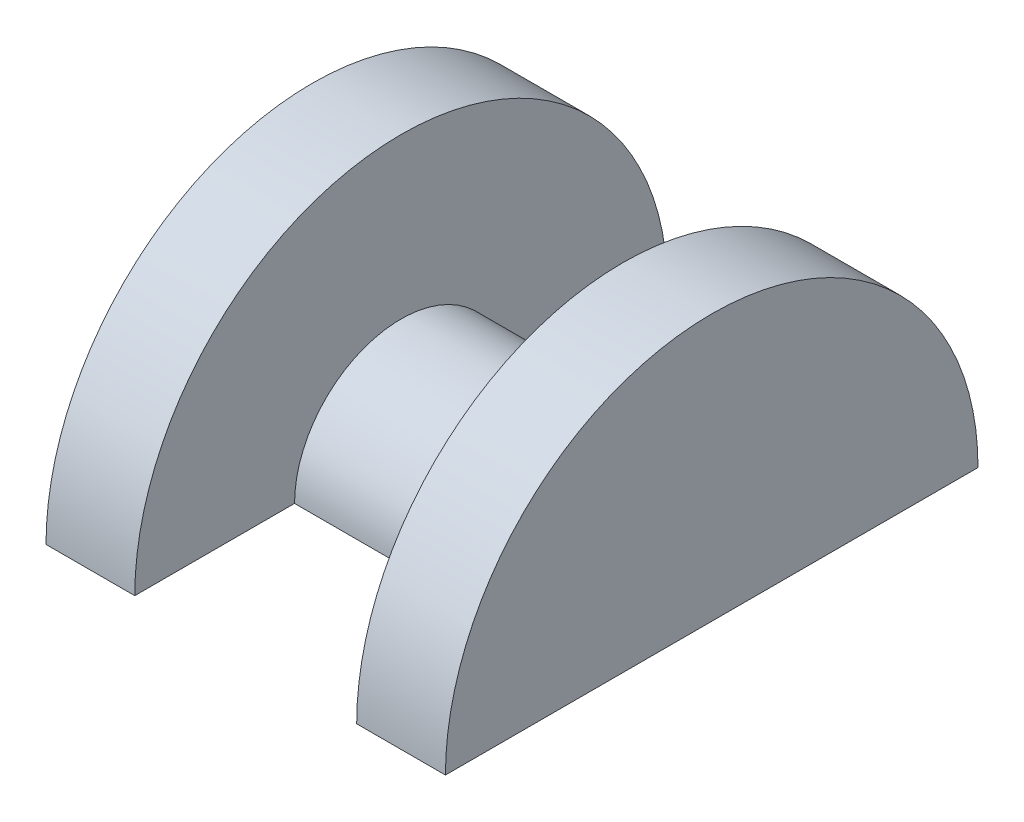
ISO-10303-21;
HEADER;
FILE_DESCRIPTION(('STEP AP214'),'2;1');
FILE_NAME('part.step','',(''),(''),'','','');
FILE_SCHEMA(('AUTOMOTIVE_DESIGN { 1 0 10303 214 1 1 1 1 }'));
ENDSEC;
DATA;
#1=APPLICATION_CONTEXT('core data for automotive mechanical design processes');
#2=APPLICATION_PROTOCOL_DEFINITION('international standard','automotive_design',2000,#1);
#3=PRODUCT_CONTEXT('',#1,'mechanical');
#4=PRODUCT('Part','Part','',(#3));
#5=PRODUCT_RELATED_PRODUCT_CATEGORY('part','',(#4));
#6=PRODUCT_DEFINITION_FORMATION('','',#4);
#7=PRODUCT_DEFINITION_CONTEXT('part definition',#1,'design');
#8=PRODUCT_DEFINITION('design','',#6,#7);
#9=PRODUCT_DEFINITION_SHAPE('','',#8);
#10=(LENGTH_UNIT() NAMED_UNIT(*) SI_UNIT(.MILLI.,.METRE.));
#11=(NAMED_UNIT(*) PLANE_ANGLE_UNIT() SI_UNIT($,.RADIAN.));
#12=(NAMED_UNIT(*) SI_UNIT($,.STERADIAN.) SOLID_ANGLE_UNIT());
#13=UNCERTAINTY_MEASURE_WITH_UNIT(LENGTH_MEASURE(1.E-05),#10,'distance_accuracy_value','');
#14=(GEOMETRIC_REPRESENTATION_CONTEXT(3) GLOBAL_UNCERTAINTY_ASSIGNED_CONTEXT((#13)) GLOBAL_UNIT_ASSIGNED_CONTEXT((#10,
#11,#12)) REPRESENTATION_CONTEXT('',''));
#15=CARTESIAN_POINT('',(0.,0.,0.));
#16=DIRECTION('',(0.,0.,1.));
#17=DIRECTION('',(1.,0.,0.));
#18=AXIS2_PLACEMENT_3D('',#15,#16,#17);
#19=CARTESIAN_POINT('',(1.,0.,0.));
#20=DIRECTION('',(-1.,0.,0.));
#21=DIRECTION('',(0.,0.,1.));
#22=AXIS2_PLACEMENT_3D('',#19,#20,#21);
#23=CYLINDRICAL_SURFACE('',#22,3.);
#24=CARTESIAN_POINT('',(0.,0.,0.));
#25=DIRECTION('',(1.,0.,0.));
#26=DIRECTION('',(0.,0.,-1.));
#27=AXIS2_PLACEMENT_3D('',#24,#25,#26);
#28=CIRCLE('',#27,3.);
#29=CARTESIAN_POINT('',(0.,0.,-3.));
#30=VERTEX_POINT('',#29);
#31=CARTESIAN_POINT('',(0.,0.,3.));
#32=VERTEX_POINT('',#31);
#33=EDGE_CURVE('E83',#30,#32,#28,.T.);
#34=ORIENTED_EDGE('',*,*,#33,.T.);
#35=DIRECTION('',(-1.,0.,0.));
#36=VECTOR('',#35,1.);
#37=CARTESIAN_POINT('',(1.,0.,3.));
#38=LINE('',#37,#36);
#39=CARTESIAN_POINT('',(1.,0.,3.));
#40=VERTEX_POINT('',#39);
#41=EDGE_CURVE('E11',#40,#32,#38,.T.);
#42=ORIENTED_EDGE('',*,*,#41,.F.);
#43=CARTESIAN_POINT('',(1.,0.,0.));
#44=DIRECTION('',(1.,0.,0.));
#45=DIRECTION('',(0.,0.,-1.));
#46=AXIS2_PLACEMENT_3D('',#43,#44,#45);
#47=CIRCLE('',#46,3.);
#48=CARTESIAN_POINT('',(1.,0.,-3.));
#49=VERTEX_POINT('',#48);
#50=EDGE_CURVE('E88',#49,#40,#47,.T.);
#51=ORIENTED_EDGE('',*,*,#50,.F.);
#52=DIRECTION('',(-1.,0.,0.));
#53=VECTOR('',#52,1.);
#54=CARTESIAN_POINT('',(1.,0.,-3.));
#55=LINE('',#54,#53);
#56=EDGE_CURVE('E43',#49,#30,#55,.T.);
#57=ORIENTED_EDGE('',*,*,#56,.T.);
#58=EDGE_LOOP('',(#34,#42,#51,#57));
#59=FACE_BOUND('',#58,.T.);
#60=ADVANCED_FACE('F35',(#59),#23,.T.);
#61=CARTESIAN_POINT('',(1.,0.,0.));
#62=DIRECTION('',(0.,1.,0.));
#63=DIRECTION('',(0.,0.,1.));
#64=AXIS2_PLACEMENT_3D('',#61,#62,#63);
#65=PLANE('',#64);
#66=DIRECTION('',(0.,0.,-1.));
#67=VECTOR('',#66,1.);
#68=CARTESIAN_POINT('',(0.,0.,0.));
#69=LINE('',#68,#67);
#70=CARTESIAN_POINT('',(0.,0.,1.2));
#71=VERTEX_POINT('',#70);
#72=EDGE_CURVE('E82',#32,#71,#69,.T.);
#73=ORIENTED_EDGE('',*,*,#72,.T.);
#74=DIRECTION('',(1.,0.,0.));
#75=VECTOR('',#74,1.);
#76=CARTESIAN_POINT('',(-1.25,0.,1.2));
#77=LINE('',#76,#75);
#78=CARTESIAN_POINT('',(-2.5,0.,1.2));
#79=VERTEX_POINT('',#78);
#80=EDGE_CURVE('E51',#79,#71,#77,.T.);
#81=ORIENTED_EDGE('',*,*,#80,.F.);
#82=DIRECTION('',(0.,0.,-1.));
#83=VECTOR('',#82,1.);
#84=CARTESIAN_POINT('',(-2.5,0.,0.));
#85=LINE('',#84,#83);
#86=CARTESIAN_POINT('',(-2.5,0.,3.));
#87=VERTEX_POINT('',#86);
#88=EDGE_CURVE('E124',#87,#79,#85,.T.);
#89=ORIENTED_EDGE('',*,*,#88,.F.);
#90=DIRECTION('',(1.,0.,0.));
#91=VECTOR('',#90,1.);
#92=CARTESIAN_POINT('',(-3.5,0.,3.));
#93=LINE('',#92,#91);
#94=CARTESIAN_POINT('',(-3.5,0.,3.));
#95=VERTEX_POINT('',#94);
#96=EDGE_CURVE('E107',#95,#87,#93,.T.);
#97=ORIENTED_EDGE('',*,*,#96,.F.);
#98=DIRECTION('',(0.,0.,-1.));
#99=VECTOR('',#98,1.);
#100=CARTESIAN_POINT('',(-3.5,0.,0.));
#101=LINE('',#100,#99);
#102=CARTESIAN_POINT('',(-3.5,0.,-3.));
#103=VERTEX_POINT('',#102);
#104=EDGE_CURVE('E120',#95,#103,#101,.T.);
#105=ORIENTED_EDGE('',*,*,#104,.T.);
#106=DIRECTION('',(1.,0.,0.));
#107=VECTOR('',#106,1.);
#108=CARTESIAN_POINT('',(-3.5,0.,-3.));
#109=LINE('',#108,#107);
#110=CARTESIAN_POINT('',(-2.5,0.,-3.));
#111=VERTEX_POINT('',#110);
#112=EDGE_CURVE('E111',#103,#111,#109,.T.);
#113=ORIENTED_EDGE('',*,*,#112,.T.);
#114=CARTESIAN_POINT('',(-2.5,0.,-1.2));
#115=VERTEX_POINT('',#114);
#116=EDGE_CURVE('E127',#115,#111,#85,.T.);
#117=ORIENTED_EDGE('',*,*,#116,.F.);
#118=DIRECTION('',(1.,0.,0.));
#119=VECTOR('',#118,1.);
#120=CARTESIAN_POINT('',(-1.25,0.,-1.2));
#121=LINE('',#120,#119);
#122=CARTESIAN_POINT('',(0.,0.,-1.2));
#123=VERTEX_POINT('',#122);
#124=EDGE_CURVE('E79',#115,#123,#121,.T.);
#125=ORIENTED_EDGE('',*,*,#124,.T.);
#126=EDGE_CURVE('E72',#123,#30,#69,.T.);
#127=ORIENTED_EDGE('',*,*,#126,.T.);
#128=ORIENTED_EDGE('',*,*,#56,.F.);
#129=DIRECTION('',(0.,0.,-1.));
#130=VECTOR('',#129,1.);
#131=CARTESIAN_POINT('',(1.,0.,0.));
#132=LINE('',#131,#130);
#133=EDGE_CURVE('E59',#40,#49,#132,.T.);
#134=ORIENTED_EDGE('',*,*,#133,.F.);
#135=ORIENTED_EDGE('',*,*,#41,.T.);
#136=EDGE_LOOP('',(#73,#81,#89,#97,#105,#113,#117,#125,#127,#128,#134,#135));
#137=FACE_BOUND('',#136,.T.);
#138=ADVANCED_FACE('F75',(#137),#65,.F.);
#139=CARTESIAN_POINT('',(1.,0.,0.));
#140=DIRECTION('',(1.,0.,0.));
#141=DIRECTION('',(0.,0.,-1.));
#142=AXIS2_PLACEMENT_3D('',#139,#140,#141);
#143=PLANE('',#142);
#144=ORIENTED_EDGE('',*,*,#50,.T.);
#145=ORIENTED_EDGE('',*,*,#133,.T.);
#146=EDGE_LOOP('',(#144,#145));
#147=FACE_BOUND('',#146,.T.);
#148=ADVANCED_FACE('F166',(#147),#143,.T.);
#149=CARTESIAN_POINT('',(0.,0.,0.));
#150=DIRECTION('',(1.,0.,0.));
#151=DIRECTION('',(0.,0.,-1.));
#152=AXIS2_PLACEMENT_3D('',#149,#150,#151);
#153=PLANE('',#152);
#154=ORIENTED_EDGE('',*,*,#126,.F.);
#155=CARTESIAN_POINT('',(0.,0.,0.));
#156=DIRECTION('',(1.,0.,0.));
#157=DIRECTION('',(0.,0.,-1.));
#158=AXIS2_PLACEMENT_3D('',#155,#156,#157);
#159=CIRCLE('',#158,1.2);
#160=EDGE_CURVE('E106',#123,#71,#159,.T.);
#161=ORIENTED_EDGE('',*,*,#160,.T.);
#162=ORIENTED_EDGE('',*,*,#72,.F.);
#163=ORIENTED_EDGE('',*,*,#33,.F.);
#164=EDGE_LOOP('',(#154,#161,#162,#163));
#165=FACE_BOUND('',#164,.T.);
#166=ADVANCED_FACE('F90',(#165),#153,.F.);
#167=CARTESIAN_POINT('',(-1.25,0.,0.));
#168=DIRECTION('',(1.,0.,0.));
#169=DIRECTION('',(0.,0.,-1.));
#170=AXIS2_PLACEMENT_3D('',#167,#168,#169);
#171=CYLINDRICAL_SURFACE('',#170,1.2);
#172=ORIENTED_EDGE('',*,*,#160,.F.);
#173=ORIENTED_EDGE('',*,*,#124,.F.);
#174=CARTESIAN_POINT('',(-2.5,0.,0.));
#175=DIRECTION('',(1.,0.,0.));
#176=DIRECTION('',(0.,0.,-1.));
#177=AXIS2_PLACEMENT_3D('',#174,#175,#176);
#178=CIRCLE('',#177,1.2);
#179=EDGE_CURVE('E103',#115,#79,#178,.T.);
#180=ORIENTED_EDGE('',*,*,#179,.T.);
#181=ORIENTED_EDGE('',*,*,#80,.T.);
#182=EDGE_LOOP('',(#172,#173,#180,#181));
#183=FACE_BOUND('',#182,.T.);
#184=ADVANCED_FACE('F158',(#183),#171,.T.);
#185=CARTESIAN_POINT('',(-3.5,0.,0.));
#186=DIRECTION('',(1.,0.,0.));
#187=DIRECTION('',(0.,0.,1.));
#188=AXIS2_PLACEMENT_3D('',#185,#186,#187);
#189=CYLINDRICAL_SURFACE('',#188,3.);
#190=CARTESIAN_POINT('',(-2.5,0.,0.));
#191=DIRECTION('',(1.,0.,0.));
#192=DIRECTION('',(0.,0.,-1.));
#193=AXIS2_PLACEMENT_3D('',#190,#191,#192);
#194=CIRCLE('',#193,3.);
#195=EDGE_CURVE('E130',#111,#87,#194,.T.);
#196=ORIENTED_EDGE('',*,*,#195,.F.);
#197=ORIENTED_EDGE('',*,*,#112,.F.);
#198=CARTESIAN_POINT('',(-3.5,0.,0.));
#199=DIRECTION('',(1.,0.,0.));
#200=DIRECTION('',(0.,0.,-1.));
#201=AXIS2_PLACEMENT_3D('',#198,#199,#200);
#202=CIRCLE('',#201,3.);
#203=EDGE_CURVE('E126',#103,#95,#202,.T.);
#204=ORIENTED_EDGE('',*,*,#203,.T.);
#205=ORIENTED_EDGE('',*,*,#96,.T.);
#206=EDGE_LOOP('',(#196,#197,#204,#205));
#207=FACE_BOUND('',#206,.T.);
#208=ADVANCED_FACE('F139',(#207),#189,.T.);
#209=CARTESIAN_POINT('',(-3.5,0.,0.));
#210=DIRECTION('',(-1.,0.,0.));
#211=DIRECTION('',(0.,0.,-1.));
#212=AXIS2_PLACEMENT_3D('',#209,#210,#211);
#213=PLANE('',#212);
#214=ORIENTED_EDGE('',*,*,#203,.F.);
#215=ORIENTED_EDGE('',*,*,#104,.F.);
#216=EDGE_LOOP('',(#214,#215));
#217=FACE_BOUND('',#216,.T.);
#218=ADVANCED_FACE('F145',(#217),#213,.T.);
#219=CARTESIAN_POINT('',(-2.5,0.,0.));
#220=DIRECTION('',(-1.,0.,0.));
#221=DIRECTION('',(0.,0.,-1.));
#222=AXIS2_PLACEMENT_3D('',#219,#220,#221);
#223=PLANE('',#222);
#224=ORIENTED_EDGE('',*,*,#116,.T.);
#225=ORIENTED_EDGE('',*,*,#195,.T.);
#226=ORIENTED_EDGE('',*,*,#88,.T.);
#227=ORIENTED_EDGE('',*,*,#179,.F.);
#228=EDGE_LOOP('',(#224,#225,#226,#227));
#229=FACE_BOUND('',#228,.T.);
#230=ADVANCED_FACE('F157',(#229),#223,.F.);
#231=CLOSED_SHELL('',(#60,#138,#148,#166,#184,#208,#218,#230));
#232=MANIFOLD_SOLID_BREP('B2',#231);
#233=ADVANCED_BREP_SHAPE_REPRESENTATION('',(#18,#232),#14);
#234=SHAPE_DEFINITION_REPRESENTATION(#9,#233);
ENDSEC;
END-ISO-10303-21;
